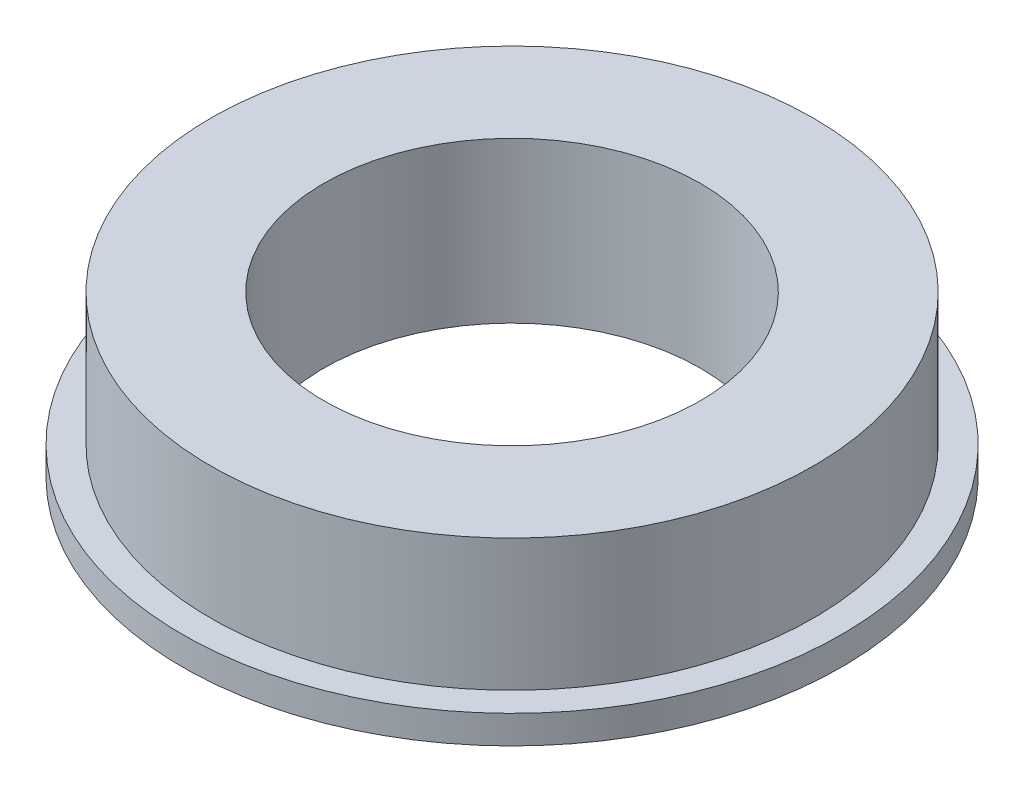
ISO-10303-21;
HEADER;
FILE_DESCRIPTION(('STEP AP214'),'2;1');
FILE_NAME('part.step','',(''),(''),'','','');
FILE_SCHEMA(('AUTOMOTIVE_DESIGN { 1 0 10303 214 1 1 1 1 }'));
ENDSEC;
DATA;
#1=APPLICATION_CONTEXT('core data for automotive mechanical design processes');
#2=APPLICATION_PROTOCOL_DEFINITION('international standard','automotive_design',2000,#1);
#3=PRODUCT_CONTEXT('',#1,'mechanical');
#4=PRODUCT('Part','Part','',(#3));
#5=PRODUCT_RELATED_PRODUCT_CATEGORY('part','',(#4));
#6=PRODUCT_DEFINITION_FORMATION('','',#4);
#7=PRODUCT_DEFINITION_CONTEXT('part definition',#1,'design');
#8=PRODUCT_DEFINITION('design','',#6,#7);
#9=PRODUCT_DEFINITION_SHAPE('','',#8);
#10=(LENGTH_UNIT() NAMED_UNIT(*) SI_UNIT(.MILLI.,.METRE.));
#11=(NAMED_UNIT(*) PLANE_ANGLE_UNIT() SI_UNIT($,.RADIAN.));
#12=(NAMED_UNIT(*) SI_UNIT($,.STERADIAN.) SOLID_ANGLE_UNIT());
#13=UNCERTAINTY_MEASURE_WITH_UNIT(LENGTH_MEASURE(1.E-05),#10,'distance_accuracy_value','');
#14=(GEOMETRIC_REPRESENTATION_CONTEXT(3) GLOBAL_UNCERTAINTY_ASSIGNED_CONTEXT((#13)) GLOBAL_UNIT_ASSIGNED_CONTEXT((#10,
#11,#12)) REPRESENTATION_CONTEXT('',''));
#15=CARTESIAN_POINT('',(0.,0.,0.));
#16=DIRECTION('',(0.,0.,1.));
#17=DIRECTION('',(1.,0.,0.));
#18=AXIS2_PLACEMENT_3D('',#15,#16,#17);
#19=CARTESIAN_POINT('',(17.5,1.5,0.));
#20=DIRECTION('',(0.,1.,0.));
#21=DIRECTION('',(0.,0.,1.));
#22=AXIS2_PLACEMENT_3D('',#19,#20,#21);
#23=PLANE('',#22);
#24=CARTESIAN_POINT('',(0.,1.5,0.));
#25=DIRECTION('',(0.,-1.,0.));
#26=DIRECTION('',(0.,0.,-1.));
#27=AXIS2_PLACEMENT_3D('',#24,#25,#26);
#28=CIRCLE('',#27,16.);
#29=CARTESIAN_POINT('',(0.,1.5,-16.));
#30=VERTEX_POINT('',#29);
#31=EDGE_CURVE('E52',#30,#30,#28,.T.);
#32=ORIENTED_EDGE('',*,*,#31,.T.);
#33=EDGE_LOOP('',(#32));
#34=FACE_BOUND('',#33,.T.);
#35=CARTESIAN_POINT('',(0.,1.5,0.));
#36=DIRECTION('',(0.,-1.,0.));
#37=DIRECTION('',(0.,0.,-1.));
#38=AXIS2_PLACEMENT_3D('',#35,#36,#37);
#39=CIRCLE('',#38,17.5);
#40=CARTESIAN_POINT('',(0.,1.5,-17.5));
#41=VERTEX_POINT('',#40);
#42=EDGE_CURVE('E10',#41,#41,#39,.T.);
#43=ORIENTED_EDGE('',*,*,#42,.F.);
#44=EDGE_LOOP('',(#43));
#45=FACE_BOUND('',#44,.T.);
#46=ADVANCED_FACE('F30',(#34,#45),#23,.T.);
#47=CARTESIAN_POINT('',(0.,7.,0.));
#48=DIRECTION('',(0.,-1.,0.));
#49=DIRECTION('',(0.,0.,-1.));
#50=AXIS2_PLACEMENT_3D('',#47,#48,#49);
#51=CYLINDRICAL_SURFACE('',#50,17.5);
#52=ORIENTED_EDGE('',*,*,#42,.T.);
#53=EDGE_LOOP('',(#52));
#54=FACE_BOUND('',#53,.T.);
#55=CARTESIAN_POINT('',(0.,0.,0.));
#56=DIRECTION('',(0.,-1.,0.));
#57=DIRECTION('',(0.,0.,-1.));
#58=AXIS2_PLACEMENT_3D('',#55,#56,#57);
#59=CIRCLE('',#58,17.5);
#60=CARTESIAN_POINT('',(0.,0.,-17.5));
#61=VERTEX_POINT('',#60);
#62=EDGE_CURVE('E36',#61,#61,#59,.T.);
#63=ORIENTED_EDGE('',*,*,#62,.F.);
#64=EDGE_LOOP('',(#63));
#65=FACE_BOUND('',#64,.T.);
#66=ADVANCED_FACE('F70',(#54,#65),#51,.T.);
#67=CARTESIAN_POINT('',(10.,0.,0.));
#68=DIRECTION('',(0.,-1.,0.));
#69=DIRECTION('',(0.,0.,-1.));
#70=AXIS2_PLACEMENT_3D('',#67,#68,#69);
#71=PLANE('',#70);
#72=ORIENTED_EDGE('',*,*,#62,.T.);
#73=EDGE_LOOP('',(#72));
#74=FACE_BOUND('',#73,.T.);
#75=CARTESIAN_POINT('',(0.,0.,0.));
#76=DIRECTION('',(0.,-1.,0.));
#77=DIRECTION('',(0.,0.,-1.));
#78=AXIS2_PLACEMENT_3D('',#75,#76,#77);
#79=CIRCLE('',#78,10.);
#80=CARTESIAN_POINT('',(0.,0.,-10.));
#81=VERTEX_POINT('',#80);
#82=EDGE_CURVE('E40',#81,#81,#79,.T.);
#83=ORIENTED_EDGE('',*,*,#82,.F.);
#84=EDGE_LOOP('',(#83));
#85=FACE_BOUND('',#84,.T.);
#86=ADVANCED_FACE('F74',(#74,#85),#71,.T.);
#87=CARTESIAN_POINT('',(0.,7.,0.));
#88=DIRECTION('',(0.,-1.,0.));
#89=DIRECTION('',(0.,0.,-1.));
#90=AXIS2_PLACEMENT_3D('',#87,#88,#89);
#91=CYLINDRICAL_SURFACE('',#90,10.);
#92=ORIENTED_EDGE('',*,*,#82,.T.);
#93=EDGE_LOOP('',(#92));
#94=FACE_BOUND('',#93,.T.);
#95=CARTESIAN_POINT('',(0.,8.5,0.));
#96=DIRECTION('',(0.,-1.,0.));
#97=DIRECTION('',(0.,0.,-1.));
#98=AXIS2_PLACEMENT_3D('',#95,#96,#97);
#99=CIRCLE('',#98,10.);
#100=CARTESIAN_POINT('',(0.,8.5,-10.));
#101=VERTEX_POINT('',#100);
#102=EDGE_CURVE('E44',#101,#101,#99,.T.);
#103=ORIENTED_EDGE('',*,*,#102,.F.);
#104=EDGE_LOOP('',(#103));
#105=FACE_BOUND('',#104,.T.);
#106=ADVANCED_FACE('F66',(#94,#105),#91,.F.);
#107=CARTESIAN_POINT('',(16.,8.5,0.));
#108=DIRECTION('',(0.,1.,0.));
#109=DIRECTION('',(0.,0.,1.));
#110=AXIS2_PLACEMENT_3D('',#107,#108,#109);
#111=PLANE('',#110);
#112=ORIENTED_EDGE('',*,*,#102,.T.);
#113=EDGE_LOOP('',(#112));
#114=FACE_BOUND('',#113,.T.);
#115=CARTESIAN_POINT('',(0.,8.5,0.));
#116=DIRECTION('',(0.,-1.,0.));
#117=DIRECTION('',(0.,0.,-1.));
#118=AXIS2_PLACEMENT_3D('',#115,#116,#117);
#119=CIRCLE('',#118,16.);
#120=CARTESIAN_POINT('',(0.,8.5,-16.));
#121=VERTEX_POINT('',#120);
#122=EDGE_CURVE('E49',#121,#121,#119,.T.);
#123=ORIENTED_EDGE('',*,*,#122,.F.);
#124=EDGE_LOOP('',(#123));
#125=FACE_BOUND('',#124,.T.);
#126=ADVANCED_FACE('F60',(#114,#125),#111,.T.);
#127=CARTESIAN_POINT('',(0.,7.,0.));
#128=DIRECTION('',(0.,-1.,0.));
#129=DIRECTION('',(0.,0.,-1.));
#130=AXIS2_PLACEMENT_3D('',#127,#128,#129);
#131=CYLINDRICAL_SURFACE('',#130,16.);
#132=ORIENTED_EDGE('',*,*,#122,.T.);
#133=EDGE_LOOP('',(#132));
#134=FACE_BOUND('',#133,.T.);
#135=ORIENTED_EDGE('',*,*,#31,.F.);
#136=EDGE_LOOP('',(#135));
#137=FACE_BOUND('',#136,.T.);
#138=ADVANCED_FACE('F58',(#134,#137),#131,.T.);
#139=CLOSED_SHELL('',(#46,#66,#86,#106,#126,#138));
#140=MANIFOLD_SOLID_BREP('B2',#139);
#141=ADVANCED_BREP_SHAPE_REPRESENTATION('',(#18,#140),#14);
#142=SHAPE_DEFINITION_REPRESENTATION(#9,#141);
ENDSEC;
END-ISO-10303-21;
